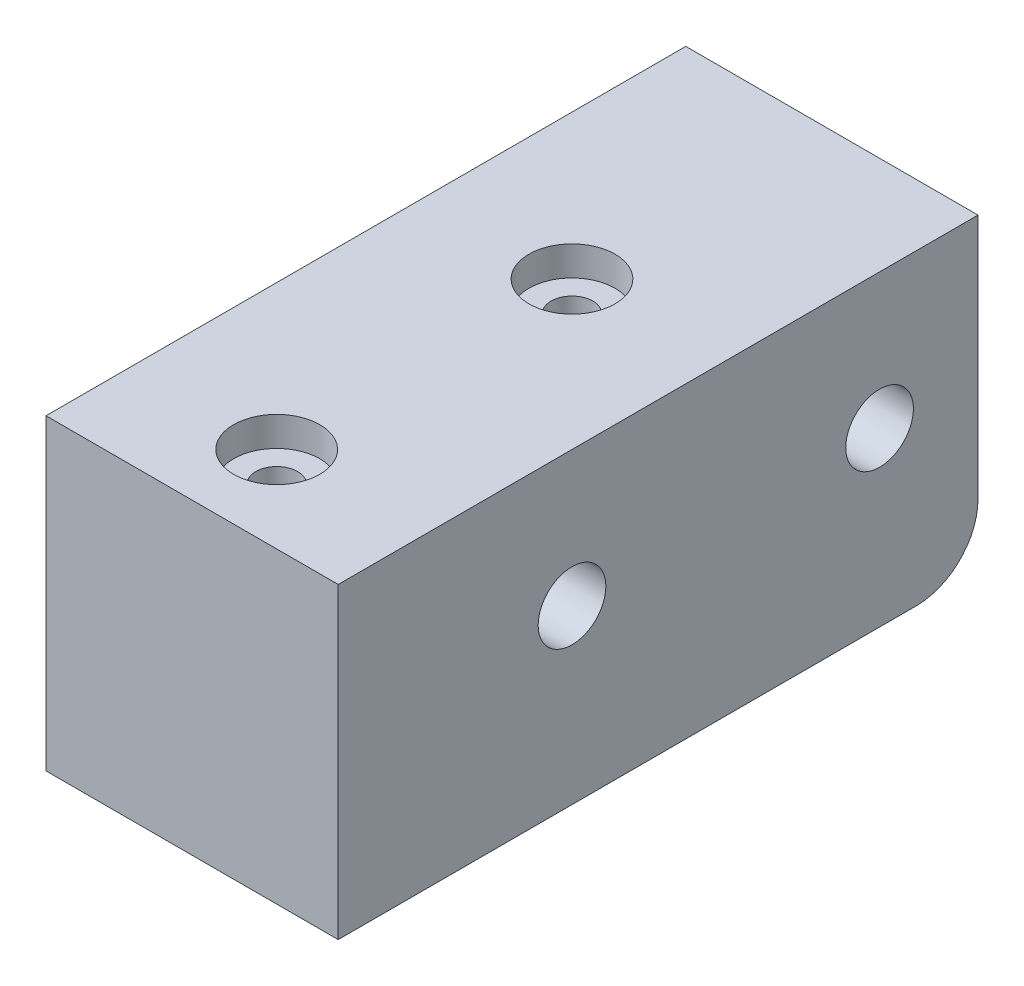
ISO-10303-21;
HEADER;
FILE_DESCRIPTION(('STEP AP214'),'2;1');
FILE_NAME('part.step','',(''),(''),'','','');
FILE_SCHEMA(('AUTOMOTIVE_DESIGN { 1 0 10303 214 1 1 1 1 }'));
ENDSEC;
DATA;
#1=APPLICATION_CONTEXT('core data for automotive mechanical design processes');
#2=APPLICATION_PROTOCOL_DEFINITION('international standard','automotive_design',2000,#1);
#3=PRODUCT_CONTEXT('',#1,'mechanical');
#4=PRODUCT('Part','Part','',(#3));
#5=PRODUCT_RELATED_PRODUCT_CATEGORY('part','',(#4));
#6=PRODUCT_DEFINITION_FORMATION('','',#4);
#7=PRODUCT_DEFINITION_CONTEXT('part definition',#1,'design');
#8=PRODUCT_DEFINITION('design','',#6,#7);
#9=PRODUCT_DEFINITION_SHAPE('','',#8);
#10=(LENGTH_UNIT() NAMED_UNIT(*) SI_UNIT(.MILLI.,.METRE.));
#11=(NAMED_UNIT(*) PLANE_ANGLE_UNIT() SI_UNIT($,.RADIAN.));
#12=(NAMED_UNIT(*) SI_UNIT($,.STERADIAN.) SOLID_ANGLE_UNIT());
#13=UNCERTAINTY_MEASURE_WITH_UNIT(LENGTH_MEASURE(1.E-05),#10,'distance_accuracy_value','');
#14=(GEOMETRIC_REPRESENTATION_CONTEXT(3) GLOBAL_UNCERTAINTY_ASSIGNED_CONTEXT((#13)) GLOBAL_UNIT_ASSIGNED_CONTEXT((#10,
#11,#12)) REPRESENTATION_CONTEXT('',''));
#15=CARTESIAN_POINT('',(0.,0.,0.));
#16=DIRECTION('',(0.,0.,1.));
#17=DIRECTION('',(1.,0.,0.));
#18=AXIS2_PLACEMENT_3D('',#15,#16,#17);
#19=CARTESIAN_POINT('',(0.,168.6,0.));
#20=DIRECTION('',(1.,0.,0.));
#21=DIRECTION('',(0.,0.,1.));
#22=AXIS2_PLACEMENT_3D('',#19,#20,#21);
#23=PLANE('',#22);
#24=CARTESIAN_POINT('',(0.,182.6,-44.));
#25=DIRECTION('',(-1.,0.,0.));
#26=DIRECTION('',(0.,0.,1.));
#27=AXIS2_PLACEMENT_3D('',#24,#25,#26);
#28=CIRCLE('',#27,2.75);
#29=CARTESIAN_POINT('',(0.,182.6,-41.25));
#30=VERTEX_POINT('',#29);
#31=EDGE_CURVE('E375',#30,#30,#28,.T.);
#32=ORIENTED_EDGE('',*,*,#31,.T.);
#33=EDGE_LOOP('',(#32));
#34=FACE_BOUND('',#33,.T.);
#35=CARTESIAN_POINT('',(0.,182.6,-19.));
#36=DIRECTION('',(-1.,0.,0.));
#37=DIRECTION('',(0.,0.,1.));
#38=AXIS2_PLACEMENT_3D('',#35,#36,#37);
#39=CIRCLE('',#38,2.75);
#40=CARTESIAN_POINT('',(0.,182.6,-16.25));
#41=VERTEX_POINT('',#40);
#42=EDGE_CURVE('E377',#41,#41,#39,.T.);
#43=ORIENTED_EDGE('',*,*,#42,.T.);
#44=EDGE_LOOP('',(#43));
#45=FACE_BOUND('',#44,.T.);
#46=DIRECTION('',(0.,1.,0.));
#47=VECTOR('',#46,1.);
#48=CARTESIAN_POINT('',(0.,168.6,-52.));
#49=LINE('',#48,#47);
#50=CARTESIAN_POINT('',(0.,173.6,-52.));
#51=VERTEX_POINT('',#50);
#52=CARTESIAN_POINT('',(0.,193.6,-52.));
#53=VERTEX_POINT('',#52);
#54=EDGE_CURVE('E214',#51,#53,#49,.T.);
#55=ORIENTED_EDGE('',*,*,#54,.T.);
#56=DIRECTION('',(0.,0.,-1.));
#57=VECTOR('',#56,1.);
#58=CARTESIAN_POINT('',(0.,193.6,0.));
#59=LINE('',#58,#57);
#60=CARTESIAN_POINT('',(0.,193.6,0.));
#61=VERTEX_POINT('',#60);
#62=EDGE_CURVE('E240',#61,#53,#59,.T.);
#63=ORIENTED_EDGE('',*,*,#62,.F.);
#64=DIRECTION('',(0.,1.,0.));
#65=VECTOR('',#64,1.);
#66=CARTESIAN_POINT('',(0.,168.6,0.));
#67=LINE('',#66,#65);
#68=CARTESIAN_POINT('',(0.,168.6,0.));
#69=VERTEX_POINT('',#68);
#70=EDGE_CURVE('E230',#69,#61,#67,.T.);
#71=ORIENTED_EDGE('',*,*,#70,.F.);
#72=DIRECTION('',(0.,0.,-1.));
#73=VECTOR('',#72,1.);
#74=CARTESIAN_POINT('',(0.,168.6,0.));
#75=LINE('',#74,#73);
#76=CARTESIAN_POINT('',(0.,168.6,-47.));
#77=VERTEX_POINT('',#76);
#78=EDGE_CURVE('E246',#69,#77,#75,.T.);
#79=ORIENTED_EDGE('',*,*,#78,.T.);
#80=CARTESIAN_POINT('',(0.,173.6,-47.));
#81=DIRECTION('',(-1.,0.,0.));
#82=DIRECTION('',(0.,0.,1.));
#83=AXIS2_PLACEMENT_3D('',#80,#81,#82);
#84=CIRCLE('',#83,5.);
#85=EDGE_CURVE('E258',#51,#77,#84,.T.);
#86=ORIENTED_EDGE('',*,*,#85,.F.);
#87=EDGE_LOOP('',(#55,#63,#71,#79,#86));
#88=FACE_BOUND('',#87,.T.);
#89=ADVANCED_FACE('F33',(#34,#45,#88),#23,.T.);
#90=CARTESIAN_POINT('',(0.,168.6,0.));
#91=DIRECTION('',(0.,-1.,0.));
#92=DIRECTION('',(0.,0.,1.));
#93=AXIS2_PLACEMENT_3D('',#90,#91,#92);
#94=PLANE('',#93);
#95=DIRECTION('',(-1.,0.,0.));
#96=VECTOR('',#95,1.);
#97=CARTESIAN_POINT('',(0.,168.6,-38.4938342076812));
#98=LINE('',#97,#96);
#99=CARTESIAN_POINT('',(-12.304054054054,168.6,-38.4938342076812));
#100=VERTEX_POINT('',#99);
#101=CARTESIAN_POINT('',(-18.5,168.6,-38.4938342076812));
#102=VERTEX_POINT('',#101);
#103=EDGE_CURVE('E190',#100,#102,#98,.T.);
#104=ORIENTED_EDGE('',*,*,#103,.T.);
#105=CARTESIAN_POINT('',(-18.5,168.6,-37.4938342076812));
#106=DIRECTION('',(0.,1.,0.));
#107=DIRECTION('',(0.,0.,1.));
#108=AXIS2_PLACEMENT_3D('',#105,#106,#107);
#109=CIRCLE('',#108,1.);
#110=CARTESIAN_POINT('',(-19.5,168.6,-37.4938342076812));
#111=VERTEX_POINT('',#110);
#112=EDGE_CURVE('E156',#102,#111,#109,.T.);
#113=ORIENTED_EDGE('',*,*,#112,.T.);
#114=DIRECTION('',(0.,0.,1.));
#115=VECTOR('',#114,1.);
#116=CARTESIAN_POINT('',(-19.4999999999999,168.6,-52.));
#117=LINE('',#116,#115);
#118=CARTESIAN_POINT('',(-19.5,168.6,-31.));
#119=VERTEX_POINT('',#118);
#120=EDGE_CURVE('E193',#111,#119,#117,.T.);
#121=ORIENTED_EDGE('',*,*,#120,.T.);
#122=CARTESIAN_POINT('',(-12.,168.6,-31.));
#123=DIRECTION('',(0.,1.,0.));
#124=DIRECTION('',(0.,0.,1.));
#125=AXIS2_PLACEMENT_3D('',#122,#123,#124);
#126=CIRCLE('',#125,7.50000000000001);
#127=CARTESIAN_POINT('',(-18.081081081081,168.6,-26.6101876024917));
#128=VERTEX_POINT('',#127);
#129=EDGE_CURVE('E196',#119,#128,#126,.T.);
#130=ORIENTED_EDGE('',*,*,#129,.T.);
#131=CARTESIAN_POINT('',(-26.5714285714284,168.6,-20.4811733408277));
#132=DIRECTION('',(0.,1.,0.));
#133=DIRECTION('',(0.,0.,1.));
#134=AXIS2_PLACEMENT_3D('',#131,#132,#133);
#135=CIRCLE('',#134,10.4714285714284);
#136=CARTESIAN_POINT('',(-16.1,168.6,-20.4811733408277));
#137=VERTEX_POINT('',#136);
#138=EDGE_CURVE('E199',#137,#128,#135,.T.);
#139=ORIENTED_EDGE('',*,*,#138,.F.);
#140=DIRECTION('',(0.,0.,1.));
#141=VECTOR('',#140,1.);
#142=CARTESIAN_POINT('',(-16.1,168.6,-52.));
#143=LINE('',#142,#141);
#144=CARTESIAN_POINT('',(-16.1,168.6,-7.00000000000001));
#145=VERTEX_POINT('',#144);
#146=EDGE_CURVE('E202',#137,#145,#143,.T.);
#147=ORIENTED_EDGE('',*,*,#146,.T.);
#148=CARTESIAN_POINT('',(-12.,168.6,-7.00000000000001));
#149=DIRECTION('',(0.,1.,0.));
#150=DIRECTION('',(0.,0.,1.));
#151=AXIS2_PLACEMENT_3D('',#148,#149,#150);
#152=CIRCLE('',#151,4.1);
#153=CARTESIAN_POINT('',(-7.89999999999996,168.6,-7.00000000000001));
#154=VERTEX_POINT('',#153);
#155=EDGE_CURVE('E205',#145,#154,#152,.T.);
#156=ORIENTED_EDGE('',*,*,#155,.T.);
#157=DIRECTION('',(0.,0.,-1.));
#158=VECTOR('',#157,1.);
#159=CARTESIAN_POINT('',(-7.89999999999997,168.6,-52.));
#160=LINE('',#159,#158);
#161=CARTESIAN_POINT('',(-7.89999999999997,168.6,-20.4811733408277));
#162=VERTEX_POINT('',#161);
#163=EDGE_CURVE('E208',#154,#162,#160,.T.);
#164=ORIENTED_EDGE('',*,*,#163,.T.);
#165=CARTESIAN_POINT('',(2.57142857142846,168.6,-20.4811733408277));
#166=DIRECTION('',(0.,1.,0.));
#167=DIRECTION('',(0.,0.,1.));
#168=AXIS2_PLACEMENT_3D('',#165,#166,#167);
#169=CIRCLE('',#168,10.4714285714284);
#170=CARTESIAN_POINT('',(-5.91891891891887,168.6,-26.6101876024917));
#171=VERTEX_POINT('',#170);
#172=EDGE_CURVE('E168',#171,#162,#169,.T.);
#173=ORIENTED_EDGE('',*,*,#172,.F.);
#174=CARTESIAN_POINT('',(-12.,168.6,-31.));
#175=DIRECTION('',(0.,1.,0.));
#176=DIRECTION('',(0.,0.,1.));
#177=AXIS2_PLACEMENT_3D('',#174,#175,#176);
#178=CIRCLE('',#177,7.5);
#179=EDGE_CURVE('E165',#171,#100,#178,.T.);
#180=ORIENTED_EDGE('',*,*,#179,.T.);
#181=EDGE_LOOP('',(#104,#113,#121,#130,#139,#147,#156,#164,#173,#180));
#182=FACE_BOUND('',#181,.T.);
#183=ORIENTED_EDGE('',*,*,#78,.F.);
#184=DIRECTION('',(1.,0.,0.));
#185=VECTOR('',#184,1.);
#186=CARTESIAN_POINT('',(0.,168.6,0.));
#187=LINE('',#186,#185);
#188=CARTESIAN_POINT('',(-23.75,168.6,0.));
#189=VERTEX_POINT('',#188);
#190=EDGE_CURVE('E238',#189,#69,#187,.T.);
#191=ORIENTED_EDGE('',*,*,#190,.F.);
#192=DIRECTION('',(0.,0.,-1.));
#193=VECTOR('',#192,1.);
#194=CARTESIAN_POINT('',(-23.75,168.6,0.));
#195=LINE('',#194,#193);
#196=CARTESIAN_POINT('',(-23.75,168.6,-47.));
#197=VERTEX_POINT('',#196);
#198=EDGE_CURVE('E250',#189,#197,#195,.T.);
#199=ORIENTED_EDGE('',*,*,#198,.T.);
#200=DIRECTION('',(1.,0.,0.));
#201=VECTOR('',#200,1.);
#202=CARTESIAN_POINT('',(0.,168.6,-47.));
#203=LINE('',#202,#201);
#204=EDGE_CURVE('E41',#77,#197,#203,.F.);
#205=ORIENTED_EDGE('',*,*,#204,.F.);
#206=EDGE_LOOP('',(#183,#191,#199,#205));
#207=FACE_BOUND('',#206,.T.);
#208=ADVANCED_FACE('F262',(#182,#207),#94,.T.);
#209=CARTESIAN_POINT('',(-23.75,168.6,0.));
#210=DIRECTION('',(-1.,0.,0.));
#211=DIRECTION('',(0.,0.,-1.));
#212=AXIS2_PLACEMENT_3D('',#209,#210,#211);
#213=PLANE('',#212);
#214=CARTESIAN_POINT('',(-23.7499999999999,182.6,-44.));
#215=DIRECTION('',(-1.,0.,0.));
#216=DIRECTION('',(0.,0.,1.));
#217=AXIS2_PLACEMENT_3D('',#214,#215,#216);
#218=CIRCLE('',#217,2.75);
#219=CARTESIAN_POINT('',(-23.7499999999999,182.6,-41.25));
#220=VERTEX_POINT('',#219);
#221=EDGE_CURVE('E373',#220,#220,#218,.T.);
#222=ORIENTED_EDGE('',*,*,#221,.F.);
#223=EDGE_LOOP('',(#222));
#224=FACE_BOUND('',#223,.T.);
#225=CARTESIAN_POINT('',(-23.7499999999999,182.6,-19.));
#226=DIRECTION('',(-1.,0.,0.));
#227=DIRECTION('',(0.,0.,1.));
#228=AXIS2_PLACEMENT_3D('',#225,#226,#227);
#229=CIRCLE('',#228,2.75);
#230=CARTESIAN_POINT('',(-23.7499999999999,182.6,-16.25));
#231=VERTEX_POINT('',#230);
#232=EDGE_CURVE('E382',#231,#231,#229,.T.);
#233=ORIENTED_EDGE('',*,*,#232,.F.);
#234=EDGE_LOOP('',(#233));
#235=FACE_BOUND('',#234,.T.);
#236=ORIENTED_EDGE('',*,*,#198,.F.);
#237=DIRECTION('',(0.,-1.,0.));
#238=VECTOR('',#237,1.);
#239=CARTESIAN_POINT('',(-23.75,168.6,0.));
#240=LINE('',#239,#238);
#241=CARTESIAN_POINT('',(-23.75,193.6,0.));
#242=VERTEX_POINT('',#241);
#243=EDGE_CURVE('E236',#242,#189,#240,.T.);
#244=ORIENTED_EDGE('',*,*,#243,.F.);
#245=DIRECTION('',(0.,0.,-1.));
#246=VECTOR('',#245,1.);
#247=CARTESIAN_POINT('',(-23.75,193.6,0.));
#248=LINE('',#247,#246);
#249=CARTESIAN_POINT('',(-23.75,193.6,-52.));
#250=VERTEX_POINT('',#249);
#251=EDGE_CURVE('E252',#242,#250,#248,.T.);
#252=ORIENTED_EDGE('',*,*,#251,.T.);
#253=DIRECTION('',(0.,-1.,0.));
#254=VECTOR('',#253,1.);
#255=CARTESIAN_POINT('',(-23.75,168.6,-52.));
#256=LINE('',#255,#254);
#257=CARTESIAN_POINT('',(-23.75,173.6,-52.));
#258=VERTEX_POINT('',#257);
#259=EDGE_CURVE('E234',#250,#258,#256,.T.);
#260=ORIENTED_EDGE('',*,*,#259,.T.);
#261=CARTESIAN_POINT('',(-23.75,173.6,-47.));
#262=DIRECTION('',(1.,0.,0.));
#263=DIRECTION('',(0.,0.,-1.));
#264=AXIS2_PLACEMENT_3D('',#261,#262,#263);
#265=CIRCLE('',#264,5.);
#266=EDGE_CURVE('E11',#197,#258,#265,.T.);
#267=ORIENTED_EDGE('',*,*,#266,.F.);
#268=EDGE_LOOP('',(#236,#244,#252,#260,#267));
#269=FACE_BOUND('',#268,.T.);
#270=ADVANCED_FACE('F264',(#224,#235,#269),#213,.T.);
#271=CARTESIAN_POINT('',(0.,193.6,0.));
#272=DIRECTION('',(0.,1.,0.));
#273=DIRECTION('',(0.,0.,-1.));
#274=AXIS2_PLACEMENT_3D('',#271,#272,#273);
#275=PLANE('',#274);
#276=CARTESIAN_POINT('',(-12.,193.6,-31.));
#277=DIRECTION('',(0.,-1.,0.));
#278=DIRECTION('',(0.,0.,-1.));
#279=AXIS2_PLACEMENT_3D('',#276,#277,#278);
#280=CIRCLE('',#279,3.5);
#281=CARTESIAN_POINT('',(-12.,193.6,-34.5));
#282=VERTEX_POINT('',#281);
#283=EDGE_CURVE('E385',#282,#282,#280,.T.);
#284=ORIENTED_EDGE('',*,*,#283,.T.);
#285=EDGE_LOOP('',(#284));
#286=FACE_BOUND('',#285,.T.);
#287=CARTESIAN_POINT('',(-12.,193.6,-7.00000000000001));
#288=DIRECTION('',(0.,-1.,0.));
#289=DIRECTION('',(0.,0.,-1.));
#290=AXIS2_PLACEMENT_3D('',#287,#288,#289);
#291=CIRCLE('',#290,3.5);
#292=CARTESIAN_POINT('',(-12.,193.6,-10.5));
#293=VERTEX_POINT('',#292);
#294=EDGE_CURVE('E397',#293,#293,#291,.T.);
#295=ORIENTED_EDGE('',*,*,#294,.T.);
#296=EDGE_LOOP('',(#295));
#297=FACE_BOUND('',#296,.T.);
#298=DIRECTION('',(-1.,0.,0.));
#299=VECTOR('',#298,1.);
#300=CARTESIAN_POINT('',(0.,193.6,-52.));
#301=LINE('',#300,#299);
#302=EDGE_CURVE('E243',#53,#250,#301,.T.);
#303=ORIENTED_EDGE('',*,*,#302,.T.);
#304=ORIENTED_EDGE('',*,*,#251,.F.);
#305=DIRECTION('',(-1.,0.,0.));
#306=VECTOR('',#305,1.);
#307=CARTESIAN_POINT('',(0.,193.6,0.));
#308=LINE('',#307,#306);
#309=EDGE_CURVE('E233',#61,#242,#308,.T.);
#310=ORIENTED_EDGE('',*,*,#309,.F.);
#311=ORIENTED_EDGE('',*,*,#62,.T.);
#312=EDGE_LOOP('',(#303,#304,#310,#311));
#313=FACE_BOUND('',#312,.T.);
#314=ADVANCED_FACE('F271',(#286,#297,#313),#275,.T.);
#315=CARTESIAN_POINT('',(0.,0.,0.));
#316=DIRECTION('',(0.,0.,-1.));
#317=DIRECTION('',(1.,0.,0.));
#318=AXIS2_PLACEMENT_3D('',#315,#316,#317);
#319=PLANE('',#318);
#320=ORIENTED_EDGE('',*,*,#70,.T.);
#321=ORIENTED_EDGE('',*,*,#309,.T.);
#322=ORIENTED_EDGE('',*,*,#243,.T.);
#323=ORIENTED_EDGE('',*,*,#190,.T.);
#324=EDGE_LOOP('',(#320,#321,#322,#323));
#325=FACE_BOUND('',#324,.T.);
#326=ADVANCED_FACE('F267',(#325),#319,.F.);
#327=CARTESIAN_POINT('',(0.,0.,-52.));
#328=DIRECTION('',(0.,0.,-1.));
#329=DIRECTION('',(1.,0.,0.));
#330=AXIS2_PLACEMENT_3D('',#327,#328,#329);
#331=PLANE('',#330);
#332=ORIENTED_EDGE('',*,*,#259,.F.);
#333=ORIENTED_EDGE('',*,*,#302,.F.);
#334=ORIENTED_EDGE('',*,*,#54,.F.);
#335=DIRECTION('',(1.,0.,0.));
#336=VECTOR('',#335,1.);
#337=CARTESIAN_POINT('',(0.,173.6,-52.));
#338=LINE('',#337,#336);
#339=EDGE_CURVE('E249',#258,#51,#338,.T.);
#340=ORIENTED_EDGE('',*,*,#339,.F.);
#341=EDGE_LOOP('',(#332,#333,#334,#340));
#342=FACE_BOUND('',#341,.T.);
#343=ADVANCED_FACE('F275',(#342),#331,.T.);
#344=CARTESIAN_POINT('',(0.,174.6,-38.4938342076812));
#345=DIRECTION('',(0.,0.,-1.));
#346=DIRECTION('',(1.,0.,0.));
#347=AXIS2_PLACEMENT_3D('',#344,#345,#346);
#348=PLANE('',#347);
#349=ORIENTED_EDGE('',*,*,#103,.F.);
#350=DIRECTION('',(0.,-1.,0.));
#351=VECTOR('',#350,1.);
#352=CARTESIAN_POINT('',(-12.304054054054,174.6,-38.4938342076812));
#353=LINE('',#352,#351);
#354=CARTESIAN_POINT('',(-12.304054054054,174.6,-38.4938342076812));
#355=VERTEX_POINT('',#354);
#356=EDGE_CURVE('E164',#355,#100,#353,.T.);
#357=ORIENTED_EDGE('',*,*,#356,.F.);
#358=DIRECTION('',(-1.,0.,0.));
#359=VECTOR('',#358,1.);
#360=CARTESIAN_POINT('',(0.,174.6,-38.4938342076812));
#361=LINE('',#360,#359);
#362=CARTESIAN_POINT('',(-18.5,174.6,-38.4938342076812));
#363=VERTEX_POINT('',#362);
#364=EDGE_CURVE('E145',#355,#363,#361,.T.);
#365=ORIENTED_EDGE('',*,*,#364,.T.);
#366=DIRECTION('',(0.,-1.,0.));
#367=VECTOR('',#366,1.);
#368=CARTESIAN_POINT('',(-18.5,174.6,-38.4938342076812));
#369=LINE('',#368,#367);
#370=EDGE_CURVE('E153',#363,#102,#369,.T.);
#371=ORIENTED_EDGE('',*,*,#370,.T.);
#372=EDGE_LOOP('',(#349,#357,#365,#371));
#373=FACE_BOUND('',#372,.T.);
#374=ADVANCED_FACE('F163',(#373),#348,.F.);
#375=CARTESIAN_POINT('',(-12.,174.6,-31.));
#376=DIRECTION('',(0.,-1.,0.));
#377=DIRECTION('',(0.,0.,1.));
#378=AXIS2_PLACEMENT_3D('',#375,#376,#377);
#379=CYLINDRICAL_SURFACE('',#378,7.5);
#380=ORIENTED_EDGE('',*,*,#179,.F.);
#381=DIRECTION('',(0.,-1.,0.));
#382=VECTOR('',#381,1.);
#383=CARTESIAN_POINT('',(-5.91891891891887,174.6,-26.6101876024917));
#384=LINE('',#383,#382);
#385=CARTESIAN_POINT('',(-5.91891891891887,174.6,-26.6101876024917));
#386=VERTEX_POINT('',#385);
#387=EDGE_CURVE('E215',#386,#171,#384,.T.);
#388=ORIENTED_EDGE('',*,*,#387,.F.);
#389=CARTESIAN_POINT('',(-12.,174.6,-31.));
#390=DIRECTION('',(0.,1.,0.));
#391=DIRECTION('',(0.,0.,1.));
#392=AXIS2_PLACEMENT_3D('',#389,#390,#391);
#393=CIRCLE('',#392,7.5);
#394=EDGE_CURVE('E161',#386,#355,#393,.T.);
#395=ORIENTED_EDGE('',*,*,#394,.T.);
#396=ORIENTED_EDGE('',*,*,#356,.T.);
#397=EDGE_LOOP('',(#380,#388,#395,#396));
#398=FACE_BOUND('',#397,.T.);
#399=ADVANCED_FACE('F299',(#398),#379,.F.);
#400=CARTESIAN_POINT('',(2.57142857142846,174.6,-20.4811733408277));
#401=DIRECTION('',(0.,-1.,0.));
#402=DIRECTION('',(0.,0.,1.));
#403=AXIS2_PLACEMENT_3D('',#400,#401,#402);
#404=CYLINDRICAL_SURFACE('',#403,10.4714285714284);
#405=ORIENTED_EDGE('',*,*,#172,.T.);
#406=DIRECTION('',(0.,-1.,0.));
#407=VECTOR('',#406,1.);
#408=CARTESIAN_POINT('',(-7.89999999999997,174.6,-20.4811733408277));
#409=LINE('',#408,#407);
#410=CARTESIAN_POINT('',(-7.89999999999997,174.6,-20.4811733408277));
#411=VERTEX_POINT('',#410);
#412=EDGE_CURVE('E217',#411,#162,#409,.T.);
#413=ORIENTED_EDGE('',*,*,#412,.F.);
#414=CARTESIAN_POINT('',(2.57142857142846,174.6,-20.4811733408277));
#415=DIRECTION('',(0.,1.,0.));
#416=DIRECTION('',(0.,0.,1.));
#417=AXIS2_PLACEMENT_3D('',#414,#415,#416);
#418=CIRCLE('',#417,10.4714285714284);
#419=EDGE_CURVE('E186',#386,#411,#418,.T.);
#420=ORIENTED_EDGE('',*,*,#419,.F.);
#421=ORIENTED_EDGE('',*,*,#387,.T.);
#422=EDGE_LOOP('',(#405,#413,#420,#421));
#423=FACE_BOUND('',#422,.T.);
#424=ADVANCED_FACE('F325',(#423),#404,.T.);
#425=CARTESIAN_POINT('',(-7.89999999999997,174.6,-52.));
#426=DIRECTION('',(1.,0.,0.));
#427=DIRECTION('',(0.,0.,1.));
#428=AXIS2_PLACEMENT_3D('',#425,#426,#427);
#429=PLANE('',#428);
#430=ORIENTED_EDGE('',*,*,#163,.F.);
#431=DIRECTION('',(0.,-1.,0.));
#432=VECTOR('',#431,1.);
#433=CARTESIAN_POINT('',(-7.89999999999996,174.6,-7.00000000000001));
#434=LINE('',#433,#432);
#435=CARTESIAN_POINT('',(-7.89999999999996,174.6,-7.00000000000001));
#436=VERTEX_POINT('',#435);
#437=EDGE_CURVE('E219',#436,#154,#434,.T.);
#438=ORIENTED_EDGE('',*,*,#437,.F.);
#439=DIRECTION('',(0.,0.,-1.));
#440=VECTOR('',#439,1.);
#441=CARTESIAN_POINT('',(-7.89999999999997,174.6,-52.));
#442=LINE('',#441,#440);
#443=EDGE_CURVE('E184',#436,#411,#442,.T.);
#444=ORIENTED_EDGE('',*,*,#443,.T.);
#445=ORIENTED_EDGE('',*,*,#412,.T.);
#446=EDGE_LOOP('',(#430,#438,#444,#445));
#447=FACE_BOUND('',#446,.T.);
#448=ADVANCED_FACE('F321',(#447),#429,.F.);
#449=CARTESIAN_POINT('',(-12.,174.6,-7.00000000000001));
#450=DIRECTION('',(0.,-1.,0.));
#451=DIRECTION('',(0.,0.,1.));
#452=AXIS2_PLACEMENT_3D('',#449,#450,#451);
#453=CYLINDRICAL_SURFACE('',#452,4.1);
#454=ORIENTED_EDGE('',*,*,#155,.F.);
#455=DIRECTION('',(0.,-1.,0.));
#456=VECTOR('',#455,1.);
#457=CARTESIAN_POINT('',(-16.1,174.6,-7.00000000000001));
#458=LINE('',#457,#456);
#459=CARTESIAN_POINT('',(-16.1,174.6,-7.00000000000001));
#460=VERTEX_POINT('',#459);
#461=EDGE_CURVE('E221',#460,#145,#458,.T.);
#462=ORIENTED_EDGE('',*,*,#461,.F.);
#463=CARTESIAN_POINT('',(-12.,174.6,-7.00000000000001));
#464=DIRECTION('',(0.,1.,0.));
#465=DIRECTION('',(0.,0.,1.));
#466=AXIS2_PLACEMENT_3D('',#463,#464,#465);
#467=CIRCLE('',#466,4.1);
#468=EDGE_CURVE('E182',#460,#436,#467,.T.);
#469=ORIENTED_EDGE('',*,*,#468,.T.);
#470=ORIENTED_EDGE('',*,*,#437,.T.);
#471=EDGE_LOOP('',(#454,#462,#469,#470));
#472=FACE_BOUND('',#471,.T.);
#473=ADVANCED_FACE('F317',(#472),#453,.F.);
#474=CARTESIAN_POINT('',(-16.1,174.6,-52.));
#475=DIRECTION('',(-1.,0.,0.));
#476=DIRECTION('',(0.,0.,-1.));
#477=AXIS2_PLACEMENT_3D('',#474,#475,#476);
#478=PLANE('',#477);
#479=ORIENTED_EDGE('',*,*,#146,.F.);
#480=DIRECTION('',(0.,-1.,0.));
#481=VECTOR('',#480,1.);
#482=CARTESIAN_POINT('',(-16.1,174.6,-20.4811733408277));
#483=LINE('',#482,#481);
#484=CARTESIAN_POINT('',(-16.1,174.6,-20.4811733408277));
#485=VERTEX_POINT('',#484);
#486=EDGE_CURVE('E223',#485,#137,#483,.T.);
#487=ORIENTED_EDGE('',*,*,#486,.F.);
#488=DIRECTION('',(0.,0.,1.));
#489=VECTOR('',#488,1.);
#490=CARTESIAN_POINT('',(-16.1,174.6,-52.));
#491=LINE('',#490,#489);
#492=EDGE_CURVE('E180',#485,#460,#491,.T.);
#493=ORIENTED_EDGE('',*,*,#492,.T.);
#494=ORIENTED_EDGE('',*,*,#461,.T.);
#495=EDGE_LOOP('',(#479,#487,#493,#494));
#496=FACE_BOUND('',#495,.T.);
#497=ADVANCED_FACE('F313',(#496),#478,.F.);
#498=CARTESIAN_POINT('',(-26.5714285714284,174.6,-20.4811733408277));
#499=DIRECTION('',(0.,-1.,0.));
#500=DIRECTION('',(0.,0.,1.));
#501=AXIS2_PLACEMENT_3D('',#498,#499,#500);
#502=CYLINDRICAL_SURFACE('',#501,10.4714285714284);
#503=ORIENTED_EDGE('',*,*,#138,.T.);
#504=DIRECTION('',(0.,-1.,0.));
#505=VECTOR('',#504,1.);
#506=CARTESIAN_POINT('',(-18.081081081081,174.6,-26.6101876024917));
#507=LINE('',#506,#505);
#508=CARTESIAN_POINT('',(-18.081081081081,174.6,-26.6101876024917));
#509=VERTEX_POINT('',#508);
#510=EDGE_CURVE('E225',#509,#128,#507,.T.);
#511=ORIENTED_EDGE('',*,*,#510,.F.);
#512=CARTESIAN_POINT('',(-26.5714285714284,174.6,-20.4811733408277));
#513=DIRECTION('',(0.,1.,0.));
#514=DIRECTION('',(0.,0.,1.));
#515=AXIS2_PLACEMENT_3D('',#512,#513,#514);
#516=CIRCLE('',#515,10.4714285714284);
#517=EDGE_CURVE('E177',#485,#509,#516,.T.);
#518=ORIENTED_EDGE('',*,*,#517,.F.);
#519=ORIENTED_EDGE('',*,*,#486,.T.);
#520=EDGE_LOOP('',(#503,#511,#518,#519));
#521=FACE_BOUND('',#520,.T.);
#522=ADVANCED_FACE('F309',(#521),#502,.T.);
#523=CARTESIAN_POINT('',(-12.,174.6,-31.));
#524=DIRECTION('',(0.,-1.,0.));
#525=DIRECTION('',(0.,0.,1.));
#526=AXIS2_PLACEMENT_3D('',#523,#524,#525);
#527=CYLINDRICAL_SURFACE('',#526,7.50000000000001);
#528=ORIENTED_EDGE('',*,*,#129,.F.);
#529=DIRECTION('',(0.,-1.,0.));
#530=VECTOR('',#529,1.);
#531=CARTESIAN_POINT('',(-19.5,174.6,-31.));
#532=LINE('',#531,#530);
#533=CARTESIAN_POINT('',(-19.5,174.6,-31.));
#534=VERTEX_POINT('',#533);
#535=EDGE_CURVE('E227',#534,#119,#532,.T.);
#536=ORIENTED_EDGE('',*,*,#535,.F.);
#537=CARTESIAN_POINT('',(-12.,174.6,-31.));
#538=DIRECTION('',(0.,1.,0.));
#539=DIRECTION('',(0.,0.,1.));
#540=AXIS2_PLACEMENT_3D('',#537,#538,#539);
#541=CIRCLE('',#540,7.50000000000001);
#542=EDGE_CURVE('E175',#534,#509,#541,.T.);
#543=ORIENTED_EDGE('',*,*,#542,.T.);
#544=ORIENTED_EDGE('',*,*,#510,.T.);
#545=EDGE_LOOP('',(#528,#536,#543,#544));
#546=FACE_BOUND('',#545,.T.);
#547=ADVANCED_FACE('F305',(#546),#527,.F.);
#548=CARTESIAN_POINT('',(-19.4999999999999,174.6,-52.));
#549=DIRECTION('',(-1.,0.,0.));
#550=DIRECTION('',(0.,0.,-1.));
#551=AXIS2_PLACEMENT_3D('',#548,#549,#550);
#552=PLANE('',#551);
#553=ORIENTED_EDGE('',*,*,#120,.F.);
#554=DIRECTION('',(0.,-1.,0.));
#555=VECTOR('',#554,1.);
#556=CARTESIAN_POINT('',(-19.5,174.6,-37.4938342076812));
#557=LINE('',#556,#555);
#558=CARTESIAN_POINT('',(-19.5,174.6,-37.4938342076812));
#559=VERTEX_POINT('',#558);
#560=EDGE_CURVE('E160',#559,#111,#557,.T.);
#561=ORIENTED_EDGE('',*,*,#560,.F.);
#562=DIRECTION('',(0.,0.,1.));
#563=VECTOR('',#562,1.);
#564=CARTESIAN_POINT('',(-19.4999999999999,174.6,-52.));
#565=LINE('',#564,#563);
#566=EDGE_CURVE('E148',#559,#534,#565,.T.);
#567=ORIENTED_EDGE('',*,*,#566,.T.);
#568=ORIENTED_EDGE('',*,*,#535,.T.);
#569=EDGE_LOOP('',(#553,#561,#567,#568));
#570=FACE_BOUND('',#569,.T.);
#571=ADVANCED_FACE('F302',(#570),#552,.F.);
#572=CARTESIAN_POINT('',(-18.5,174.6,-37.4938342076812));
#573=DIRECTION('',(0.,-1.,0.));
#574=DIRECTION('',(0.,0.,1.));
#575=AXIS2_PLACEMENT_3D('',#572,#573,#574);
#576=CYLINDRICAL_SURFACE('',#575,1.);
#577=ORIENTED_EDGE('',*,*,#112,.F.);
#578=ORIENTED_EDGE('',*,*,#370,.F.);
#579=CARTESIAN_POINT('',(-18.5,174.6,-37.4938342076812));
#580=DIRECTION('',(0.,1.,0.));
#581=DIRECTION('',(0.,0.,1.));
#582=AXIS2_PLACEMENT_3D('',#579,#580,#581);
#583=CIRCLE('',#582,1.);
#584=EDGE_CURVE('E140',#363,#559,#583,.T.);
#585=ORIENTED_EDGE('',*,*,#584,.T.);
#586=ORIENTED_EDGE('',*,*,#560,.T.);
#587=EDGE_LOOP('',(#577,#578,#585,#586));
#588=FACE_BOUND('',#587,.T.);
#589=ADVANCED_FACE('F154',(#588),#576,.F.);
#590=CARTESIAN_POINT('',(0.,174.6,-52.));
#591=DIRECTION('',(0.,-1.,0.));
#592=DIRECTION('',(0.,0.,1.));
#593=AXIS2_PLACEMENT_3D('',#590,#591,#592);
#594=PLANE('',#593);
#595=CARTESIAN_POINT('',(-12.,174.6,-31.));
#596=DIRECTION('',(0.,1.,0.));
#597=DIRECTION('',(0.,0.,1.));
#598=AXIS2_PLACEMENT_3D('',#595,#596,#597);
#599=CIRCLE('',#598,1.7);
#600=CARTESIAN_POINT('',(-12.,174.6,-29.3));
#601=VERTEX_POINT('',#600);
#602=EDGE_CURVE('E394',#601,#601,#599,.T.);
#603=ORIENTED_EDGE('',*,*,#602,.T.);
#604=EDGE_LOOP('',(#603));
#605=FACE_BOUND('',#604,.T.);
#606=CARTESIAN_POINT('',(-12.,174.6,-7.00000000000001));
#607=DIRECTION('',(0.,1.,0.));
#608=DIRECTION('',(0.,0.,1.));
#609=AXIS2_PLACEMENT_3D('',#606,#607,#608);
#610=CIRCLE('',#609,1.7);
#611=CARTESIAN_POINT('',(-12.,174.6,-5.30000000000001));
#612=VERTEX_POINT('',#611);
#613=EDGE_CURVE('E171',#612,#612,#610,.T.);
#614=ORIENTED_EDGE('',*,*,#613,.T.);
#615=EDGE_LOOP('',(#614));
#616=FACE_BOUND('',#615,.T.);
#617=ORIENTED_EDGE('',*,*,#364,.F.);
#618=ORIENTED_EDGE('',*,*,#394,.F.);
#619=ORIENTED_EDGE('',*,*,#419,.T.);
#620=ORIENTED_EDGE('',*,*,#443,.F.);
#621=ORIENTED_EDGE('',*,*,#468,.F.);
#622=ORIENTED_EDGE('',*,*,#492,.F.);
#623=ORIENTED_EDGE('',*,*,#517,.T.);
#624=ORIENTED_EDGE('',*,*,#542,.F.);
#625=ORIENTED_EDGE('',*,*,#566,.F.);
#626=ORIENTED_EDGE('',*,*,#584,.F.);
#627=EDGE_LOOP('',(#617,#618,#619,#620,#621,#622,#623,#624,#625,#626));
#628=FACE_BOUND('',#627,.T.);
#629=ADVANCED_FACE('F142',(#605,#616,#628),#594,.T.);
#630=CARTESIAN_POINT('',(-12.,193.6,-7.00000000000001));
#631=DIRECTION('',(0.,1.,0.));
#632=DIRECTION('',(0.,0.,-1.));
#633=AXIS2_PLACEMENT_3D('',#630,#631,#632);
#634=CYLINDRICAL_SURFACE('',#633,1.7);
#635=CARTESIAN_POINT('',(-12.,191.2,-7.00000000000001));
#636=DIRECTION('',(0.,-1.,0.));
#637=DIRECTION('',(0.,0.,-1.));
#638=AXIS2_PLACEMENT_3D('',#635,#636,#637);
#639=CIRCLE('',#638,1.7);
#640=CARTESIAN_POINT('',(-12.,191.2,-8.70000000000001));
#641=VERTEX_POINT('',#640);
#642=EDGE_CURVE('E402',#641,#641,#639,.T.);
#643=ORIENTED_EDGE('',*,*,#642,.F.);
#644=EDGE_LOOP('',(#643));
#645=FACE_BOUND('',#644,.T.);
#646=ORIENTED_EDGE('',*,*,#613,.F.);
#647=EDGE_LOOP('',(#646));
#648=FACE_BOUND('',#647,.T.);
#649=ADVANCED_FACE('F335',(#645,#648),#634,.F.);
#650=CARTESIAN_POINT('',(-10.3,191.2,-7.00000000000001));
#651=DIRECTION('',(0.,-1.,0.));
#652=DIRECTION('',(0.,0.,1.));
#653=AXIS2_PLACEMENT_3D('',#650,#651,#652);
#654=PLANE('',#653);
#655=ORIENTED_EDGE('',*,*,#642,.T.);
#656=EDGE_LOOP('',(#655));
#657=FACE_BOUND('',#656,.T.);
#658=CARTESIAN_POINT('',(-12.,191.2,-7.00000000000001));
#659=DIRECTION('',(0.,-1.,0.));
#660=DIRECTION('',(0.,0.,-1.));
#661=AXIS2_PLACEMENT_3D('',#658,#659,#660);
#662=CIRCLE('',#661,3.5);
#663=CARTESIAN_POINT('',(-12.,191.2,-10.5));
#664=VERTEX_POINT('',#663);
#665=EDGE_CURVE('E400',#664,#664,#662,.T.);
#666=ORIENTED_EDGE('',*,*,#665,.F.);
#667=EDGE_LOOP('',(#666));
#668=FACE_BOUND('',#667,.T.);
#669=ADVANCED_FACE('F339',(#657,#668),#654,.F.);
#670=CARTESIAN_POINT('',(-12.,193.6,-7.00000000000001));
#671=DIRECTION('',(0.,1.,0.));
#672=DIRECTION('',(0.,0.,-1.));
#673=AXIS2_PLACEMENT_3D('',#670,#671,#672);
#674=CYLINDRICAL_SURFACE('',#673,3.5);
#675=ORIENTED_EDGE('',*,*,#665,.T.);
#676=EDGE_LOOP('',(#675));
#677=FACE_BOUND('',#676,.T.);
#678=ORIENTED_EDGE('',*,*,#294,.F.);
#679=EDGE_LOOP('',(#678));
#680=FACE_BOUND('',#679,.T.);
#681=ADVANCED_FACE('F343',(#677,#680),#674,.F.);
#682=CARTESIAN_POINT('',(-12.,193.6,-31.));
#683=DIRECTION('',(0.,1.,0.));
#684=DIRECTION('',(0.,0.,-1.));
#685=AXIS2_PLACEMENT_3D('',#682,#683,#684);
#686=CYLINDRICAL_SURFACE('',#685,1.7);
#687=CARTESIAN_POINT('',(-12.,191.2,-31.));
#688=DIRECTION('',(0.,-1.,0.));
#689=DIRECTION('',(0.,0.,-1.));
#690=AXIS2_PLACEMENT_3D('',#687,#688,#689);
#691=CIRCLE('',#690,1.7);
#692=CARTESIAN_POINT('',(-12.,191.2,-32.7));
#693=VERTEX_POINT('',#692);
#694=EDGE_CURVE('E391',#693,#693,#691,.T.);
#695=ORIENTED_EDGE('',*,*,#694,.F.);
#696=EDGE_LOOP('',(#695));
#697=FACE_BOUND('',#696,.T.);
#698=ORIENTED_EDGE('',*,*,#602,.F.);
#699=EDGE_LOOP('',(#698));
#700=FACE_BOUND('',#699,.T.);
#701=ADVANCED_FACE('F347',(#697,#700),#686,.F.);
#702=CARTESIAN_POINT('',(-10.3,191.2,-31.));
#703=DIRECTION('',(0.,-1.,0.));
#704=DIRECTION('',(0.,0.,1.));
#705=AXIS2_PLACEMENT_3D('',#702,#703,#704);
#706=PLANE('',#705);
#707=ORIENTED_EDGE('',*,*,#694,.T.);
#708=EDGE_LOOP('',(#707));
#709=FACE_BOUND('',#708,.T.);
#710=CARTESIAN_POINT('',(-12.,191.2,-31.));
#711=DIRECTION('',(0.,-1.,0.));
#712=DIRECTION('',(0.,0.,-1.));
#713=AXIS2_PLACEMENT_3D('',#710,#711,#712);
#714=CIRCLE('',#713,3.5);
#715=CARTESIAN_POINT('',(-12.,191.2,-34.5));
#716=VERTEX_POINT('',#715);
#717=EDGE_CURVE('E388',#716,#716,#714,.T.);
#718=ORIENTED_EDGE('',*,*,#717,.F.);
#719=EDGE_LOOP('',(#718));
#720=FACE_BOUND('',#719,.T.);
#721=ADVANCED_FACE('F351',(#709,#720),#706,.F.);
#722=CARTESIAN_POINT('',(-12.,193.6,-31.));
#723=DIRECTION('',(0.,1.,0.));
#724=DIRECTION('',(0.,0.,-1.));
#725=AXIS2_PLACEMENT_3D('',#722,#723,#724);
#726=CYLINDRICAL_SURFACE('',#725,3.5);
#727=ORIENTED_EDGE('',*,*,#717,.T.);
#728=EDGE_LOOP('',(#727));
#729=FACE_BOUND('',#728,.T.);
#730=ORIENTED_EDGE('',*,*,#283,.F.);
#731=EDGE_LOOP('',(#730));
#732=FACE_BOUND('',#731,.T.);
#733=ADVANCED_FACE('F355',(#729,#732),#726,.F.);
#734=CARTESIAN_POINT('',(0.,182.6,-19.));
#735=DIRECTION('',(1.,0.,0.));
#736=DIRECTION('',(0.,0.,1.));
#737=AXIS2_PLACEMENT_3D('',#734,#735,#736);
#738=CYLINDRICAL_SURFACE('',#737,2.75);
#739=ORIENTED_EDGE('',*,*,#232,.T.);
#740=EDGE_LOOP('',(#739));
#741=FACE_BOUND('',#740,.T.);
#742=ORIENTED_EDGE('',*,*,#42,.F.);
#743=EDGE_LOOP('',(#742));
#744=FACE_BOUND('',#743,.T.);
#745=ADVANCED_FACE('F359',(#741,#744),#738,.F.);
#746=CARTESIAN_POINT('',(0.,182.6,-44.));
#747=DIRECTION('',(1.,0.,0.));
#748=DIRECTION('',(0.,0.,1.));
#749=AXIS2_PLACEMENT_3D('',#746,#747,#748);
#750=CYLINDRICAL_SURFACE('',#749,2.75);
#751=ORIENTED_EDGE('',*,*,#221,.T.);
#752=EDGE_LOOP('',(#751));
#753=FACE_BOUND('',#752,.T.);
#754=ORIENTED_EDGE('',*,*,#31,.F.);
#755=EDGE_LOOP('',(#754));
#756=FACE_BOUND('',#755,.T.);
#757=ADVANCED_FACE('F363',(#753,#756),#750,.F.);
#758=CARTESIAN_POINT('',(0.,173.6,-47.));
#759=DIRECTION('',(1.,0.,0.));
#760=DIRECTION('',(0.,0.,1.));
#761=AXIS2_PLACEMENT_3D('',#758,#759,#760);
#762=CYLINDRICAL_SURFACE('',#761,5.);
#763=ORIENTED_EDGE('',*,*,#266,.T.);
#764=ORIENTED_EDGE('',*,*,#339,.T.);
#765=ORIENTED_EDGE('',*,*,#85,.T.);
#766=ORIENTED_EDGE('',*,*,#204,.T.);
#767=EDGE_LOOP('',(#763,#764,#765,#766));
#768=FACE_BOUND('',#767,.T.);
#769=ADVANCED_FACE('F35',(#768),#762,.T.);
#770=CLOSED_SHELL('',(#89,#208,#270,#314,#326,#343,#374,#399,#424,#448,#473,#497,#522,#547,#571,
#589,#629,#649,#669,#681,#701,#721,#733,#745,#757,#769));
#771=MANIFOLD_SOLID_BREP('B2',#770);
#772=ADVANCED_BREP_SHAPE_REPRESENTATION('',(#18,#771),#14);
#773=SHAPE_DEFINITION_REPRESENTATION(#9,#772);
ENDSEC;
END-ISO-10303-21;
